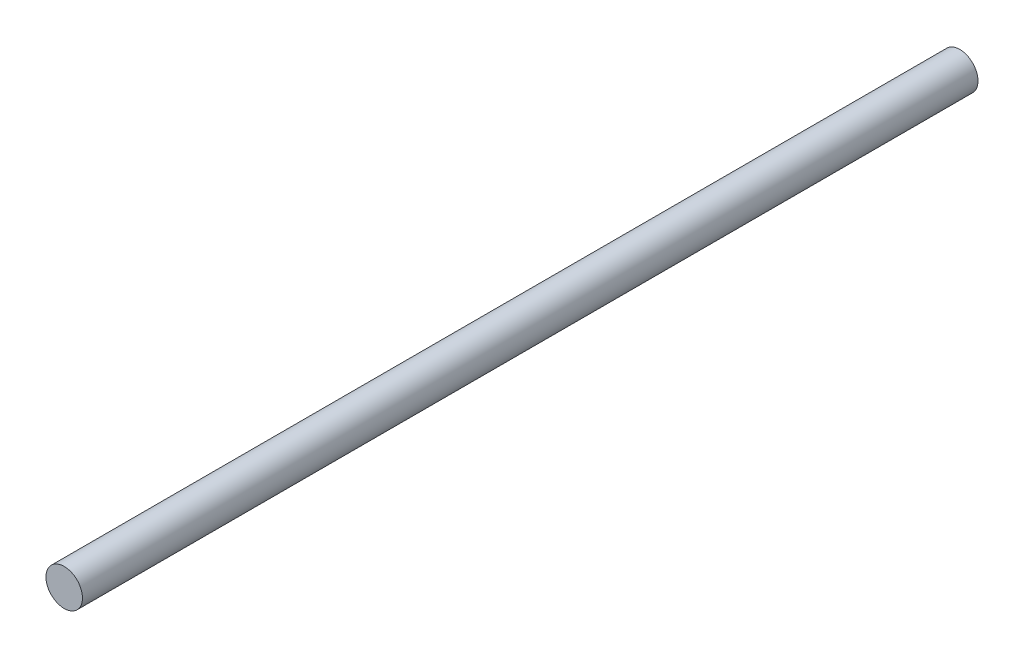
ISO-10303-21;
HEADER;
FILE_DESCRIPTION(('STEP AP214'),'2;1');
FILE_NAME('part.step','',(''),(''),'','','');
FILE_SCHEMA(('AUTOMOTIVE_DESIGN { 1 0 10303 214 1 1 1 1 }'));
ENDSEC;
DATA;
#1=APPLICATION_CONTEXT('core data for automotive mechanical design processes');
#2=APPLICATION_PROTOCOL_DEFINITION('international standard','automotive_design',2000,#1);
#3=PRODUCT_CONTEXT('',#1,'mechanical');
#4=PRODUCT('Part','Part','',(#3));
#5=PRODUCT_RELATED_PRODUCT_CATEGORY('part','',(#4));
#6=PRODUCT_DEFINITION_FORMATION('','',#4);
#7=PRODUCT_DEFINITION_CONTEXT('part definition',#1,'design');
#8=PRODUCT_DEFINITION('design','',#6,#7);
#9=PRODUCT_DEFINITION_SHAPE('','',#8);
#10=(LENGTH_UNIT() NAMED_UNIT(*) SI_UNIT(.MILLI.,.METRE.));
#11=(NAMED_UNIT(*) PLANE_ANGLE_UNIT() SI_UNIT($,.RADIAN.));
#12=(NAMED_UNIT(*) SI_UNIT($,.STERADIAN.) SOLID_ANGLE_UNIT());
#13=UNCERTAINTY_MEASURE_WITH_UNIT(LENGTH_MEASURE(1.E-05),#10,'distance_accuracy_value','');
#14=(GEOMETRIC_REPRESENTATION_CONTEXT(3) GLOBAL_UNCERTAINTY_ASSIGNED_CONTEXT((#13)) GLOBAL_UNIT_ASSIGNED_CONTEXT((#10,
#11,#12)) REPRESENTATION_CONTEXT('',''));
#15=CARTESIAN_POINT('',(0.,0.,0.));
#16=DIRECTION('',(0.,0.,1.));
#17=DIRECTION('',(1.,0.,0.));
#18=AXIS2_PLACEMENT_3D('',#15,#16,#17);
#19=CARTESIAN_POINT('',(0.,0.,164.270562748477));
#20=DIRECTION('',(0.,0.,-1.));
#21=DIRECTION('',(-1.,0.,0.));
#22=AXIS2_PLACEMENT_3D('',#19,#20,#21);
#23=CYLINDRICAL_SURFACE('',#22,6.);
#24=CARTESIAN_POINT('',(0.,0.,147.3));
#25=DIRECTION('',(0.,0.,1.));
#26=DIRECTION('',(1.,0.,0.));
#27=AXIS2_PLACEMENT_3D('',#24,#25,#26);
#28=CIRCLE('',#27,6.);
#29=CARTESIAN_POINT('',(6.,0.,147.3));
#30=VERTEX_POINT('',#29);
#31=EDGE_CURVE('E10',#30,#30,#28,.T.);
#32=ORIENTED_EDGE('',*,*,#31,.F.);
#33=EDGE_LOOP('',(#32));
#34=FACE_BOUND('',#33,.T.);
#35=CARTESIAN_POINT('',(0.,0.,-147.3));
#36=DIRECTION('',(0.,0.,1.));
#37=DIRECTION('',(1.,0.,0.));
#38=AXIS2_PLACEMENT_3D('',#35,#36,#37);
#39=CIRCLE('',#38,6.);
#40=CARTESIAN_POINT('',(6.,0.,-147.3));
#41=VERTEX_POINT('',#40);
#42=EDGE_CURVE('E39',#41,#41,#39,.T.);
#43=ORIENTED_EDGE('',*,*,#42,.T.);
#44=EDGE_LOOP('',(#43));
#45=FACE_BOUND('',#44,.T.);
#46=ADVANCED_FACE('F32',(#34,#45),#23,.T.);
#47=CARTESIAN_POINT('',(0.,-104.,147.3));
#48=DIRECTION('',(0.,0.,1.));
#49=DIRECTION('',(1.,0.,0.));
#50=AXIS2_PLACEMENT_3D('',#47,#48,#49);
#51=PLANE('',#50);
#52=ORIENTED_EDGE('',*,*,#31,.T.);
#53=EDGE_LOOP('',(#52));
#54=FACE_BOUND('',#53,.T.);
#55=ADVANCED_FACE('F34',(#54),#51,.T.);
#56=CARTESIAN_POINT('',(0.,-104.,-147.3));
#57=DIRECTION('',(0.,0.,-1.));
#58=DIRECTION('',(1.,0.,0.));
#59=AXIS2_PLACEMENT_3D('',#56,#57,#58);
#60=PLANE('',#59);
#61=ORIENTED_EDGE('',*,*,#42,.F.);
#62=EDGE_LOOP('',(#61));
#63=FACE_BOUND('',#62,.T.);
#64=ADVANCED_FACE('F46',(#63),#60,.T.);
#65=CLOSED_SHELL('',(#46,#55,#64));
#66=MANIFOLD_SOLID_BREP('B2',#65);
#67=ADVANCED_BREP_SHAPE_REPRESENTATION('',(#18,#66),#14);
#68=SHAPE_DEFINITION_REPRESENTATION(#9,#67);
ENDSEC;
END-ISO-10303-21;
